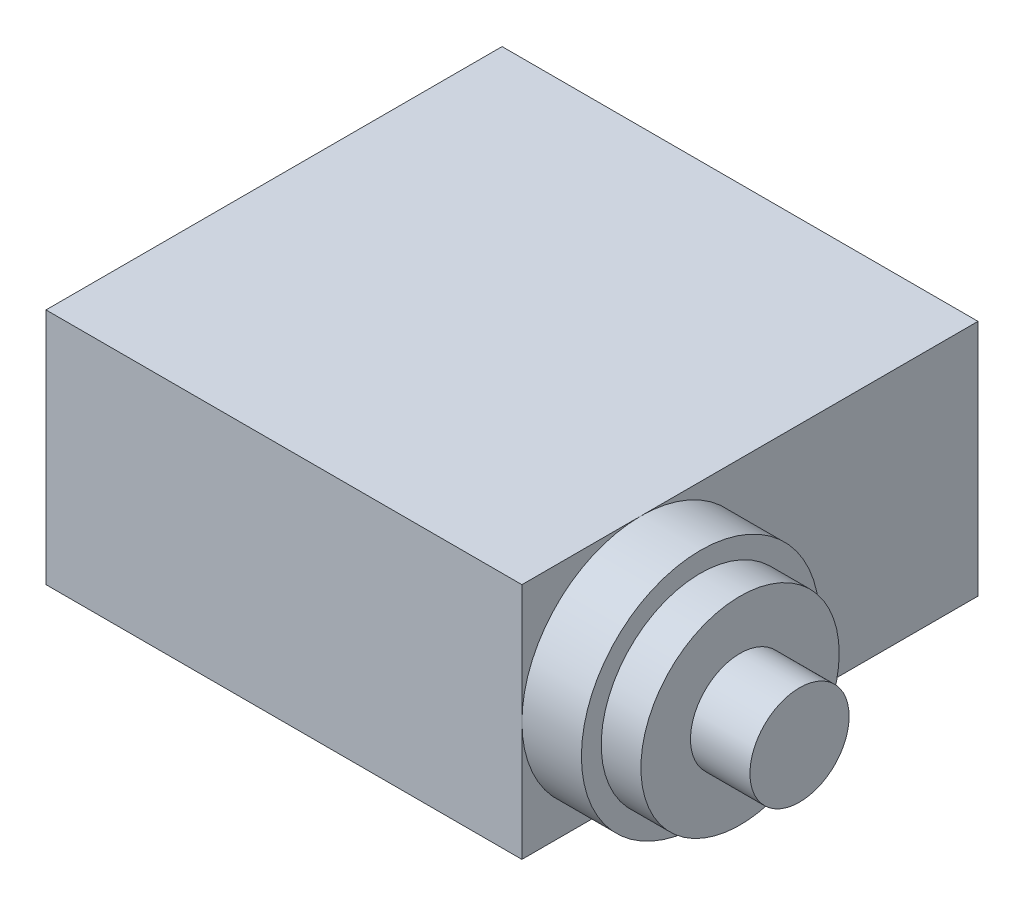
ISO-10303-21;
HEADER;
FILE_DESCRIPTION(('STEP AP214'),'2;1');
FILE_NAME('part.step','',(''),(''),'','','');
FILE_SCHEMA(('AUTOMOTIVE_DESIGN { 1 0 10303 214 1 1 1 1 }'));
ENDSEC;
DATA;
#1=APPLICATION_CONTEXT('core data for automotive mechanical design processes');
#2=APPLICATION_PROTOCOL_DEFINITION('international standard','automotive_design',2000,#1);
#3=PRODUCT_CONTEXT('',#1,'mechanical');
#4=PRODUCT('Part','Part','',(#3));
#5=PRODUCT_RELATED_PRODUCT_CATEGORY('part','',(#4));
#6=PRODUCT_DEFINITION_FORMATION('','',#4);
#7=PRODUCT_DEFINITION_CONTEXT('part definition',#1,'design');
#8=PRODUCT_DEFINITION('design','',#6,#7);
#9=PRODUCT_DEFINITION_SHAPE('','',#8);
#10=(LENGTH_UNIT() NAMED_UNIT(*) SI_UNIT(.MILLI.,.METRE.));
#11=(NAMED_UNIT(*) PLANE_ANGLE_UNIT() SI_UNIT($,.RADIAN.));
#12=(NAMED_UNIT(*) SI_UNIT($,.STERADIAN.) SOLID_ANGLE_UNIT());
#13=UNCERTAINTY_MEASURE_WITH_UNIT(LENGTH_MEASURE(1.E-05),#10,'distance_accuracy_value','');
#14=(GEOMETRIC_REPRESENTATION_CONTEXT(3) GLOBAL_UNCERTAINTY_ASSIGNED_CONTEXT((#13)) GLOBAL_UNIT_ASSIGNED_CONTEXT((#10,
#11,#12)) REPRESENTATION_CONTEXT('',''));
#15=CARTESIAN_POINT('',(0.,0.,0.));
#16=DIRECTION('',(0.,0.,1.));
#17=DIRECTION('',(1.,0.,0.));
#18=AXIS2_PLACEMENT_3D('',#15,#16,#17);
#19=CARTESIAN_POINT('',(12.,12.,11.5));
#20=DIRECTION('',(-1.,0.,0.));
#21=DIRECTION('',(0.,0.,1.));
#22=AXIS2_PLACEMENT_3D('',#19,#20,#21);
#23=PLANE('',#22);
#24=CARTESIAN_POINT('',(12.,6.,5.5));
#25=DIRECTION('',(1.,0.,0.));
#26=DIRECTION('',(0.,0.,-1.));
#27=AXIS2_PLACEMENT_3D('',#24,#25,#26);
#28=CIRCLE('',#27,6.);
#29=CARTESIAN_POINT('',(12.,12.,5.5));
#30=VERTEX_POINT('',#29);
#31=CARTESIAN_POINT('',(12.,6.,11.5));
#32=VERTEX_POINT('',#31);
#33=EDGE_CURVE('E104',#30,#32,#28,.T.);
#34=ORIENTED_EDGE('',*,*,#33,.F.);
#35=DIRECTION('',(0.,0.,-1.));
#36=VECTOR('',#35,1.);
#37=CARTESIAN_POINT('',(12.,12.,11.5));
#38=LINE('',#37,#36);
#39=CARTESIAN_POINT('',(12.,12.,11.5));
#40=VERTEX_POINT('',#39);
#41=EDGE_CURVE('E87',#40,#30,#38,.T.);
#42=ORIENTED_EDGE('',*,*,#41,.F.);
#43=DIRECTION('',(0.,-1.,0.));
#44=VECTOR('',#43,1.);
#45=CARTESIAN_POINT('',(12.,12.,11.5));
#46=LINE('',#45,#44);
#47=EDGE_CURVE('E105',#40,#32,#46,.T.);
#48=ORIENTED_EDGE('',*,*,#47,.T.);
#49=EDGE_LOOP('',(#34,#42,#48));
#50=FACE_BOUND('',#49,.T.);
#51=ADVANCED_FACE('F34',(#50),#23,.F.);
#52=CARTESIAN_POINT('',(12.,0.,5.5));
#53=VERTEX_POINT('',#52);
#54=EDGE_CURVE('E51',#32,#53,#28,.T.);
#55=ORIENTED_EDGE('',*,*,#54,.F.);
#56=CARTESIAN_POINT('',(12.,0.,11.5));
#57=VERTEX_POINT('',#56);
#58=EDGE_CURVE('E133',#32,#57,#46,.T.);
#59=ORIENTED_EDGE('',*,*,#58,.T.);
#60=DIRECTION('',(0.,0.,-1.));
#61=VECTOR('',#60,1.);
#62=CARTESIAN_POINT('',(12.,0.,11.5));
#63=LINE('',#62,#61);
#64=EDGE_CURVE('E128',#57,#53,#63,.T.);
#65=ORIENTED_EDGE('',*,*,#64,.T.);
#66=EDGE_LOOP('',(#55,#59,#65));
#67=FACE_BOUND('',#66,.T.);
#68=ADVANCED_FACE('F134',(#67),#23,.F.);
#69=CARTESIAN_POINT('',(-12.,12.,11.5));
#70=DIRECTION('',(1.,0.,0.));
#71=DIRECTION('',(0.,0.,-1.));
#72=AXIS2_PLACEMENT_3D('',#69,#70,#71);
#73=PLANE('',#72);
#74=DIRECTION('',(0.,0.,1.));
#75=VECTOR('',#74,1.);
#76=CARTESIAN_POINT('',(-12.,0.,11.5));
#77=LINE('',#76,#75);
#78=CARTESIAN_POINT('',(-12.,0.,-11.5));
#79=VERTEX_POINT('',#78);
#80=CARTESIAN_POINT('',(-12.,0.,11.5));
#81=VERTEX_POINT('',#80);
#82=EDGE_CURVE('E121',#79,#81,#77,.T.);
#83=ORIENTED_EDGE('',*,*,#82,.T.);
#84=DIRECTION('',(0.,-1.,0.));
#85=VECTOR('',#84,1.);
#86=CARTESIAN_POINT('',(-12.,12.,11.5));
#87=LINE('',#86,#85);
#88=CARTESIAN_POINT('',(-12.,12.,11.5));
#89=VERTEX_POINT('',#88);
#90=EDGE_CURVE('E38',#89,#81,#87,.T.);
#91=ORIENTED_EDGE('',*,*,#90,.F.);
#92=DIRECTION('',(0.,0.,1.));
#93=VECTOR('',#92,1.);
#94=CARTESIAN_POINT('',(-12.,12.,11.5));
#95=LINE('',#94,#93);
#96=CARTESIAN_POINT('',(-12.,12.,-11.5));
#97=VERTEX_POINT('',#96);
#98=EDGE_CURVE('E115',#97,#89,#95,.T.);
#99=ORIENTED_EDGE('',*,*,#98,.F.);
#100=DIRECTION('',(0.,-1.,0.));
#101=VECTOR('',#100,1.);
#102=CARTESIAN_POINT('',(-12.,12.,-11.5));
#103=LINE('',#102,#101);
#104=EDGE_CURVE('E120',#97,#79,#103,.T.);
#105=ORIENTED_EDGE('',*,*,#104,.T.);
#106=EDGE_LOOP('',(#83,#91,#99,#105));
#107=FACE_BOUND('',#106,.T.);
#108=ADVANCED_FACE('F36',(#107),#73,.F.);
#109=CARTESIAN_POINT('',(12.,12.,11.5));
#110=DIRECTION('',(0.,0.,-1.));
#111=DIRECTION('',(-1.,0.,0.));
#112=AXIS2_PLACEMENT_3D('',#109,#110,#111);
#113=PLANE('',#112);
#114=DIRECTION('',(1.,0.,0.));
#115=VECTOR('',#114,1.);
#116=CARTESIAN_POINT('',(12.,0.,11.5));
#117=LINE('',#116,#115);
#118=EDGE_CURVE('E124',#81,#57,#117,.T.);
#119=ORIENTED_EDGE('',*,*,#118,.T.);
#120=ORIENTED_EDGE('',*,*,#58,.F.);
#121=ORIENTED_EDGE('',*,*,#47,.F.);
#122=DIRECTION('',(1.,0.,0.));
#123=VECTOR('',#122,1.);
#124=CARTESIAN_POINT('',(12.,12.,11.5));
#125=LINE('',#124,#123);
#126=EDGE_CURVE('E92',#89,#40,#125,.T.);
#127=ORIENTED_EDGE('',*,*,#126,.F.);
#128=ORIENTED_EDGE('',*,*,#90,.T.);
#129=EDGE_LOOP('',(#119,#120,#121,#127,#128));
#130=FACE_BOUND('',#129,.T.);
#131=ADVANCED_FACE('F137',(#130),#113,.F.);
#132=EDGE_CURVE('E59',#53,#30,#28,.T.);
#133=ORIENTED_EDGE('',*,*,#132,.F.);
#134=CARTESIAN_POINT('',(12.,0.,-11.5));
#135=VERTEX_POINT('',#134);
#136=EDGE_CURVE('E127',#53,#135,#63,.T.);
#137=ORIENTED_EDGE('',*,*,#136,.T.);
#138=DIRECTION('',(0.,-1.,0.));
#139=VECTOR('',#138,1.);
#140=CARTESIAN_POINT('',(12.,12.,-11.5));
#141=LINE('',#140,#139);
#142=CARTESIAN_POINT('',(12.,12.,-11.5));
#143=VERTEX_POINT('',#142);
#144=EDGE_CURVE('E101',#143,#135,#141,.T.);
#145=ORIENTED_EDGE('',*,*,#144,.F.);
#146=EDGE_CURVE('E90',#30,#143,#38,.T.);
#147=ORIENTED_EDGE('',*,*,#146,.F.);
#148=EDGE_LOOP('',(#133,#137,#145,#147));
#149=FACE_BOUND('',#148,.T.);
#150=ADVANCED_FACE('F99',(#149),#23,.F.);
#151=CARTESIAN_POINT('',(12.,12.,-11.5));
#152=DIRECTION('',(0.,0.,1.));
#153=DIRECTION('',(1.,0.,0.));
#154=AXIS2_PLACEMENT_3D('',#151,#152,#153);
#155=PLANE('',#154);
#156=DIRECTION('',(-1.,0.,0.));
#157=VECTOR('',#156,1.);
#158=CARTESIAN_POINT('',(12.,0.,-11.5));
#159=LINE('',#158,#157);
#160=EDGE_CURVE('E117',#135,#79,#159,.T.);
#161=ORIENTED_EDGE('',*,*,#160,.T.);
#162=ORIENTED_EDGE('',*,*,#104,.F.);
#163=DIRECTION('',(-1.,0.,0.));
#164=VECTOR('',#163,1.);
#165=CARTESIAN_POINT('',(12.,12.,-11.5));
#166=LINE('',#165,#164);
#167=EDGE_CURVE('E97',#143,#97,#166,.T.);
#168=ORIENTED_EDGE('',*,*,#167,.F.);
#169=ORIENTED_EDGE('',*,*,#144,.T.);
#170=EDGE_LOOP('',(#161,#162,#168,#169));
#171=FACE_BOUND('',#170,.T.);
#172=ADVANCED_FACE('F144',(#171),#155,.F.);
#173=CARTESIAN_POINT('',(0.,12.,0.));
#174=DIRECTION('',(0.,1.,0.));
#175=DIRECTION('',(0.,0.,1.));
#176=AXIS2_PLACEMENT_3D('',#173,#174,#175);
#177=PLANE('',#176);
#178=ORIENTED_EDGE('',*,*,#98,.T.);
#179=ORIENTED_EDGE('',*,*,#126,.T.);
#180=ORIENTED_EDGE('',*,*,#41,.T.);
#181=ORIENTED_EDGE('',*,*,#146,.T.);
#182=ORIENTED_EDGE('',*,*,#167,.T.);
#183=EDGE_LOOP('',(#178,#179,#180,#181,#182));
#184=FACE_BOUND('',#183,.T.);
#185=ADVANCED_FACE('F89',(#184),#177,.T.);
#186=CARTESIAN_POINT('',(0.,0.,0.));
#187=DIRECTION('',(0.,1.,0.));
#188=DIRECTION('',(0.,0.,1.));
#189=AXIS2_PLACEMENT_3D('',#186,#187,#188);
#190=PLANE('',#189);
#191=ORIENTED_EDGE('',*,*,#82,.F.);
#192=ORIENTED_EDGE('',*,*,#160,.F.);
#193=ORIENTED_EDGE('',*,*,#136,.F.);
#194=ORIENTED_EDGE('',*,*,#64,.F.);
#195=ORIENTED_EDGE('',*,*,#118,.F.);
#196=EDGE_LOOP('',(#191,#192,#193,#194,#195));
#197=FACE_BOUND('',#196,.T.);
#198=ADVANCED_FACE('F141',(#197),#190,.F.);
#199=CARTESIAN_POINT('',(15.,6.,5.5));
#200=DIRECTION('',(-1.,0.,0.));
#201=DIRECTION('',(0.,0.,1.));
#202=AXIS2_PLACEMENT_3D('',#199,#200,#201);
#203=CYLINDRICAL_SURFACE('',#202,6.);
#204=CARTESIAN_POINT('',(15.,6.,5.5));
#205=DIRECTION('',(1.,0.,0.));
#206=DIRECTION('',(0.,0.,-1.));
#207=AXIS2_PLACEMENT_3D('',#204,#205,#206);
#208=CIRCLE('',#207,6.);
#209=CARTESIAN_POINT('',(15.,6.,-0.500000000000003));
#210=VERTEX_POINT('',#209);
#211=EDGE_CURVE('E107',#210,#210,#208,.T.);
#212=ORIENTED_EDGE('',*,*,#211,.F.);
#213=EDGE_LOOP('',(#212));
#214=FACE_BOUND('',#213,.T.);
#215=ORIENTED_EDGE('',*,*,#33,.T.);
#216=ORIENTED_EDGE('',*,*,#54,.T.);
#217=ORIENTED_EDGE('',*,*,#132,.T.);
#218=EDGE_LOOP('',(#215,#216,#217));
#219=FACE_BOUND('',#218,.T.);
#220=ADVANCED_FACE('F110',(#214,#219),#203,.T.);
#221=CARTESIAN_POINT('',(15.,6.,5.5));
#222=DIRECTION('',(1.,0.,0.));
#223=DIRECTION('',(0.,0.,-1.));
#224=AXIS2_PLACEMENT_3D('',#221,#222,#223);
#225=PLANE('',#224);
#226=CARTESIAN_POINT('',(15.,6.,5.5));
#227=DIRECTION('',(1.,0.,0.));
#228=DIRECTION('',(0.,0.,-1.));
#229=AXIS2_PLACEMENT_3D('',#226,#227,#228);
#230=CIRCLE('',#229,5.);
#231=CARTESIAN_POINT('',(15.,6.,0.499999999999996));
#232=VERTEX_POINT('',#231);
#233=EDGE_CURVE('E43',#232,#232,#230,.T.);
#234=ORIENTED_EDGE('',*,*,#233,.F.);
#235=EDGE_LOOP('',(#234));
#236=FACE_BOUND('',#235,.T.);
#237=ORIENTED_EDGE('',*,*,#211,.T.);
#238=EDGE_LOOP('',(#237));
#239=FACE_BOUND('',#238,.T.);
#240=ADVANCED_FACE('F171',(#236,#239),#225,.T.);
#241=CARTESIAN_POINT('',(17.,6.,5.5));
#242=DIRECTION('',(-1.,0.,0.));
#243=DIRECTION('',(0.,0.,1.));
#244=AXIS2_PLACEMENT_3D('',#241,#242,#243);
#245=CYLINDRICAL_SURFACE('',#244,5.);
#246=CARTESIAN_POINT('',(17.,6.,5.5));
#247=DIRECTION('',(1.,0.,0.));
#248=DIRECTION('',(0.,0.,-1.));
#249=AXIS2_PLACEMENT_3D('',#246,#247,#248);
#250=CIRCLE('',#249,5.);
#251=CARTESIAN_POINT('',(17.,6.,0.499999999999996));
#252=VERTEX_POINT('',#251);
#253=EDGE_CURVE('E108',#252,#252,#250,.T.);
#254=ORIENTED_EDGE('',*,*,#253,.F.);
#255=EDGE_LOOP('',(#254));
#256=FACE_BOUND('',#255,.T.);
#257=ORIENTED_EDGE('',*,*,#233,.T.);
#258=EDGE_LOOP('',(#257));
#259=FACE_BOUND('',#258,.T.);
#260=ADVANCED_FACE('F175',(#256,#259),#245,.T.);
#261=CARTESIAN_POINT('',(17.,6.,5.5));
#262=DIRECTION('',(1.,0.,0.));
#263=DIRECTION('',(0.,0.,-1.));
#264=AXIS2_PLACEMENT_3D('',#261,#262,#263);
#265=PLANE('',#264);
#266=CARTESIAN_POINT('',(17.,6.,5.5));
#267=DIRECTION('',(1.,0.,0.));
#268=DIRECTION('',(0.,0.,-1.));
#269=AXIS2_PLACEMENT_3D('',#266,#267,#268);
#270=CIRCLE('',#269,2.5);
#271=CARTESIAN_POINT('',(17.,6.,3.));
#272=VERTEX_POINT('',#271);
#273=EDGE_CURVE('E11',#272,#272,#270,.T.);
#274=ORIENTED_EDGE('',*,*,#273,.F.);
#275=EDGE_LOOP('',(#274));
#276=FACE_BOUND('',#275,.T.);
#277=ORIENTED_EDGE('',*,*,#253,.T.);
#278=EDGE_LOOP('',(#277));
#279=FACE_BOUND('',#278,.T.);
#280=ADVANCED_FACE('F179',(#276,#279),#265,.T.);
#281=CARTESIAN_POINT('',(20.,6.,5.5));
#282=DIRECTION('',(-1.,0.,0.));
#283=DIRECTION('',(0.,0.,1.));
#284=AXIS2_PLACEMENT_3D('',#281,#282,#283);
#285=CYLINDRICAL_SURFACE('',#284,2.5);
#286=CARTESIAN_POINT('',(20.,6.,5.5));
#287=DIRECTION('',(1.,0.,0.));
#288=DIRECTION('',(0.,0.,-1.));
#289=AXIS2_PLACEMENT_3D('',#286,#287,#288);
#290=CIRCLE('',#289,2.5);
#291=CARTESIAN_POINT('',(20.,6.,3.));
#292=VERTEX_POINT('',#291);
#293=EDGE_CURVE('E195',#292,#292,#290,.T.);
#294=ORIENTED_EDGE('',*,*,#293,.F.);
#295=EDGE_LOOP('',(#294));
#296=FACE_BOUND('',#295,.T.);
#297=ORIENTED_EDGE('',*,*,#273,.T.);
#298=EDGE_LOOP('',(#297));
#299=FACE_BOUND('',#298,.T.);
#300=ADVANCED_FACE('F183',(#296,#299),#285,.T.);
#301=CARTESIAN_POINT('',(20.,6.,5.5));
#302=DIRECTION('',(1.,0.,0.));
#303=DIRECTION('',(0.,0.,-1.));
#304=AXIS2_PLACEMENT_3D('',#301,#302,#303);
#305=PLANE('',#304);
#306=ORIENTED_EDGE('',*,*,#293,.T.);
#307=EDGE_LOOP('',(#306));
#308=FACE_BOUND('',#307,.T.);
#309=ADVANCED_FACE('F187',(#308),#305,.T.);
#310=CLOSED_SHELL('',(#51,#68,#108,#131,#150,#172,#185,#198,#220,#240,#260,#280,#300,#309));
#311=MANIFOLD_SOLID_BREP('B2',#310);
#312=ADVANCED_BREP_SHAPE_REPRESENTATION('',(#18,#311),#14);
#313=SHAPE_DEFINITION_REPRESENTATION(#9,#312);
ENDSEC;
END-ISO-10303-21;
